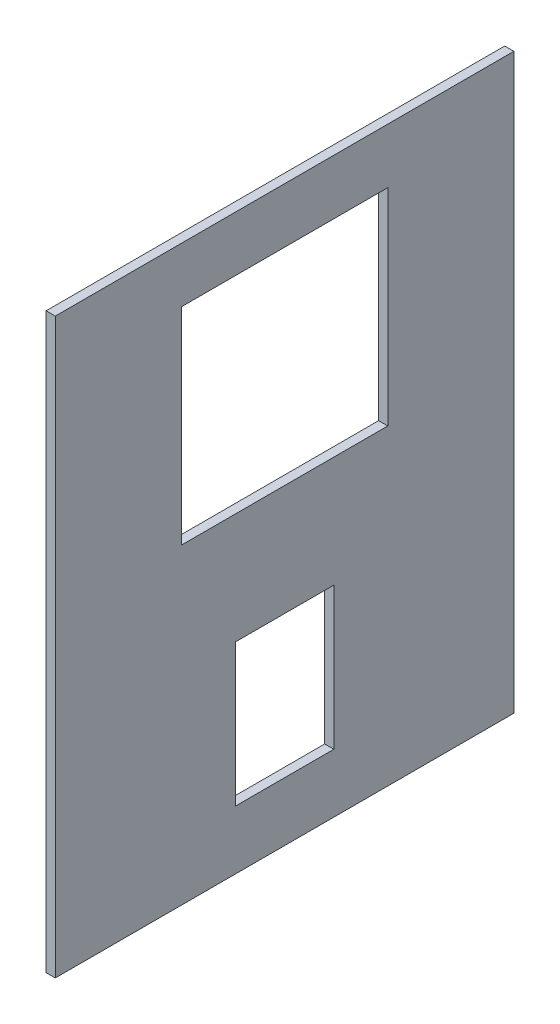
ISO-10303-21;
HEADER;
FILE_DESCRIPTION(('STEP AP214'),'2;1');
FILE_NAME('part.step','',(''),(''),'','','');
FILE_SCHEMA(('AUTOMOTIVE_DESIGN { 1 0 10303 214 1 1 1 1 }'));
ENDSEC;
DATA;
#1=APPLICATION_CONTEXT('core data for automotive mechanical design processes');
#2=APPLICATION_PROTOCOL_DEFINITION('international standard','automotive_design',2000,#1);
#3=PRODUCT_CONTEXT('',#1,'mechanical');
#4=PRODUCT('Part','Part','',(#3));
#5=PRODUCT_RELATED_PRODUCT_CATEGORY('part','',(#4));
#6=PRODUCT_DEFINITION_FORMATION('','',#4);
#7=PRODUCT_DEFINITION_CONTEXT('part definition',#1,'design');
#8=PRODUCT_DEFINITION('design','',#6,#7);
#9=PRODUCT_DEFINITION_SHAPE('','',#8);
#10=(LENGTH_UNIT() NAMED_UNIT(*) SI_UNIT(.MILLI.,.METRE.));
#11=(NAMED_UNIT(*) PLANE_ANGLE_UNIT() SI_UNIT($,.RADIAN.));
#12=(NAMED_UNIT(*) SI_UNIT($,.STERADIAN.) SOLID_ANGLE_UNIT());
#13=UNCERTAINTY_MEASURE_WITH_UNIT(LENGTH_MEASURE(1.E-05),#10,'distance_accuracy_value','');
#14=(GEOMETRIC_REPRESENTATION_CONTEXT(3) GLOBAL_UNCERTAINTY_ASSIGNED_CONTEXT((#13)) GLOBAL_UNIT_ASSIGNED_CONTEXT((#10,
#11,#12)) REPRESENTATION_CONTEXT('',''));
#15=CARTESIAN_POINT('',(0.,0.,0.));
#16=DIRECTION('',(0.,0.,1.));
#17=DIRECTION('',(1.,0.,0.));
#18=AXIS2_PLACEMENT_3D('',#15,#16,#17);
#19=CARTESIAN_POINT('',(60.5,62.5,50.));
#20=DIRECTION('',(-1.,0.,0.));
#21=DIRECTION('',(0.,0.,1.));
#22=AXIS2_PLACEMENT_3D('',#19,#20,#21);
#23=PLANE('',#22);
#24=DIRECTION('',(0.,1.,0.));
#25=VECTOR('',#24,1.);
#26=CARTESIAN_POINT('',(60.5,50.5,-22.5));
#27=LINE('',#26,#25);
#28=CARTESIAN_POINT('',(60.5,5.50000000000001,-22.5));
#29=VERTEX_POINT('',#28);
#30=CARTESIAN_POINT('',(60.5,50.5,-22.5));
#31=VERTEX_POINT('',#30);
#32=EDGE_CURVE('E133',#29,#31,#27,.T.);
#33=ORIENTED_EDGE('',*,*,#32,.T.);
#34=DIRECTION('',(0.,0.,1.));
#35=VECTOR('',#34,1.);
#36=CARTESIAN_POINT('',(60.5,50.5,22.5));
#37=LINE('',#36,#35);
#38=CARTESIAN_POINT('',(60.5,50.5,22.5));
#39=VERTEX_POINT('',#38);
#40=EDGE_CURVE('E126',#31,#39,#37,.T.);
#41=ORIENTED_EDGE('',*,*,#40,.T.);
#42=DIRECTION('',(0.,-1.,0.));
#43=VECTOR('',#42,1.);
#44=CARTESIAN_POINT('',(60.5,50.5,22.5));
#45=LINE('',#44,#43);
#46=CARTESIAN_POINT('',(60.5,5.50000000000001,22.5));
#47=VERTEX_POINT('',#46);
#48=EDGE_CURVE('E130',#39,#47,#45,.T.);
#49=ORIENTED_EDGE('',*,*,#48,.T.);
#50=DIRECTION('',(0.,0.,-1.));
#51=VECTOR('',#50,1.);
#52=CARTESIAN_POINT('',(60.5,5.50000000000001,22.5));
#53=LINE('',#52,#51);
#54=EDGE_CURVE('E151',#47,#29,#53,.T.);
#55=ORIENTED_EDGE('',*,*,#54,.T.);
#56=EDGE_LOOP('',(#33,#41,#49,#55));
#57=FACE_BOUND('',#56,.T.);
#58=DIRECTION('',(0.,1.,0.));
#59=VECTOR('',#58,1.);
#60=CARTESIAN_POINT('',(60.5,-18.6773814841814,-10.75));
#61=LINE('',#60,#59);
#62=CARTESIAN_POINT('',(60.5,-49.6773814841814,-10.75));
#63=VERTEX_POINT('',#62);
#64=CARTESIAN_POINT('',(60.5,-18.6773814841814,-10.75));
#65=VERTEX_POINT('',#64);
#66=EDGE_CURVE('E170',#63,#65,#61,.T.);
#67=ORIENTED_EDGE('',*,*,#66,.T.);
#68=DIRECTION('',(0.,0.,1.));
#69=VECTOR('',#68,1.);
#70=CARTESIAN_POINT('',(60.5,-18.6773814841814,10.75));
#71=LINE('',#70,#69);
#72=CARTESIAN_POINT('',(60.5,-18.6773814841814,10.75));
#73=VERTEX_POINT('',#72);
#74=EDGE_CURVE('E172',#65,#73,#71,.T.);
#75=ORIENTED_EDGE('',*,*,#74,.T.);
#76=DIRECTION('',(0.,-1.,0.));
#77=VECTOR('',#76,1.);
#78=CARTESIAN_POINT('',(60.5,-18.6773814841814,10.75));
#79=LINE('',#78,#77);
#80=CARTESIAN_POINT('',(60.5,-49.6773814841814,10.75));
#81=VERTEX_POINT('',#80);
#82=EDGE_CURVE('E175',#73,#81,#79,.T.);
#83=ORIENTED_EDGE('',*,*,#82,.T.);
#84=DIRECTION('',(0.,0.,-1.));
#85=VECTOR('',#84,1.);
#86=CARTESIAN_POINT('',(60.5,-49.6773814841814,10.75));
#87=LINE('',#86,#85);
#88=EDGE_CURVE('E177',#81,#63,#87,.T.);
#89=ORIENTED_EDGE('',*,*,#88,.T.);
#90=EDGE_LOOP('',(#67,#75,#83,#89));
#91=FACE_BOUND('',#90,.T.);
#92=DIRECTION('',(0.,0.,-1.));
#93=VECTOR('',#92,1.);
#94=CARTESIAN_POINT('',(60.5,62.5,0.));
#95=LINE('',#94,#93);
#96=CARTESIAN_POINT('',(60.5,62.5,50.));
#97=VERTEX_POINT('',#96);
#98=CARTESIAN_POINT('',(60.5,62.5,-50.));
#99=VERTEX_POINT('',#98);
#100=EDGE_CURVE('E11',#97,#99,#95,.T.);
#101=ORIENTED_EDGE('',*,*,#100,.T.);
#102=DIRECTION('',(0.,-1.,0.));
#103=VECTOR('',#102,1.);
#104=CARTESIAN_POINT('',(60.5,62.5,-50.));
#105=LINE('',#104,#103);
#106=CARTESIAN_POINT('',(60.5,-62.5,-50.));
#107=VERTEX_POINT('',#106);
#108=EDGE_CURVE('E38',#99,#107,#105,.T.);
#109=ORIENTED_EDGE('',*,*,#108,.T.);
#110=DIRECTION('',(0.,0.,-1.));
#111=VECTOR('',#110,1.);
#112=CARTESIAN_POINT('',(60.5,-62.5,0.));
#113=LINE('',#112,#111);
#114=CARTESIAN_POINT('',(60.5,-62.5,50.));
#115=VERTEX_POINT('',#114);
#116=EDGE_CURVE('E214',#115,#107,#113,.T.);
#117=ORIENTED_EDGE('',*,*,#116,.F.);
#118=DIRECTION('',(0.,1.,0.));
#119=VECTOR('',#118,1.);
#120=CARTESIAN_POINT('',(60.5,62.5,50.));
#121=LINE('',#120,#119);
#122=EDGE_CURVE('E43',#115,#97,#121,.T.);
#123=ORIENTED_EDGE('',*,*,#122,.T.);
#124=EDGE_LOOP('',(#101,#109,#117,#123));
#125=FACE_BOUND('',#124,.T.);
#126=ADVANCED_FACE('F34',(#57,#91,#125),#23,.T.);
#127=CARTESIAN_POINT('',(60.5,50.5,22.5));
#128=DIRECTION('',(0.,1.,0.));
#129=DIRECTION('',(0.,0.,1.));
#130=AXIS2_PLACEMENT_3D('',#127,#128,#129);
#131=PLANE('',#130);
#132=DIRECTION('',(0.,0.,1.));
#133=VECTOR('',#132,1.);
#134=CARTESIAN_POINT('',(62.5,50.5,22.5));
#135=LINE('',#134,#133);
#136=CARTESIAN_POINT('',(62.5,50.5,-22.5));
#137=VERTEX_POINT('',#136);
#138=CARTESIAN_POINT('',(62.5,50.5,22.5));
#139=VERTEX_POINT('',#138);
#140=EDGE_CURVE('E142',#137,#139,#135,.T.);
#141=ORIENTED_EDGE('',*,*,#140,.T.);
#142=DIRECTION('',(1.,0.,0.));
#143=VECTOR('',#142,1.);
#144=CARTESIAN_POINT('',(60.5,50.5,22.5));
#145=LINE('',#144,#143);
#146=EDGE_CURVE('E139',#39,#139,#145,.T.);
#147=ORIENTED_EDGE('',*,*,#146,.F.);
#148=ORIENTED_EDGE('',*,*,#40,.F.);
#149=DIRECTION('',(1.,0.,0.));
#150=VECTOR('',#149,1.);
#151=CARTESIAN_POINT('',(60.5,50.5,-22.5));
#152=LINE('',#151,#150);
#153=EDGE_CURVE('E147',#31,#137,#152,.T.);
#154=ORIENTED_EDGE('',*,*,#153,.T.);
#155=EDGE_LOOP('',(#141,#147,#148,#154));
#156=FACE_BOUND('',#155,.T.);
#157=ADVANCED_FACE('F140',(#156),#131,.F.);
#158=CARTESIAN_POINT('',(60.5,50.5,22.5));
#159=DIRECTION('',(0.,0.,1.));
#160=DIRECTION('',(0.,-1.,0.));
#161=AXIS2_PLACEMENT_3D('',#158,#159,#160);
#162=PLANE('',#161);
#163=DIRECTION('',(0.,-1.,0.));
#164=VECTOR('',#163,1.);
#165=CARTESIAN_POINT('',(62.5,50.5,22.5));
#166=LINE('',#165,#164);
#167=CARTESIAN_POINT('',(62.5,5.50000000000001,22.5));
#168=VERTEX_POINT('',#167);
#169=EDGE_CURVE('E160',#139,#168,#166,.T.);
#170=ORIENTED_EDGE('',*,*,#169,.T.);
#171=DIRECTION('',(1.,0.,0.));
#172=VECTOR('',#171,1.);
#173=CARTESIAN_POINT('',(60.5,5.50000000000001,22.5));
#174=LINE('',#173,#172);
#175=EDGE_CURVE('E146',#47,#168,#174,.T.);
#176=ORIENTED_EDGE('',*,*,#175,.F.);
#177=ORIENTED_EDGE('',*,*,#48,.F.);
#178=ORIENTED_EDGE('',*,*,#146,.T.);
#179=EDGE_LOOP('',(#170,#176,#177,#178));
#180=FACE_BOUND('',#179,.T.);
#181=ADVANCED_FACE('F149',(#180),#162,.F.);
#182=CARTESIAN_POINT('',(60.5,50.5,-22.5));
#183=DIRECTION('',(0.,0.,-1.));
#184=DIRECTION('',(0.,1.,0.));
#185=AXIS2_PLACEMENT_3D('',#182,#183,#184);
#186=PLANE('',#185);
#187=DIRECTION('',(0.,1.,0.));
#188=VECTOR('',#187,1.);
#189=CARTESIAN_POINT('',(62.5,50.5,-22.5));
#190=LINE('',#189,#188);
#191=CARTESIAN_POINT('',(62.5,5.50000000000001,-22.5));
#192=VERTEX_POINT('',#191);
#193=EDGE_CURVE('E156',#192,#137,#190,.T.);
#194=ORIENTED_EDGE('',*,*,#193,.T.);
#195=ORIENTED_EDGE('',*,*,#153,.F.);
#196=ORIENTED_EDGE('',*,*,#32,.F.);
#197=DIRECTION('',(1.,0.,0.));
#198=VECTOR('',#197,1.);
#199=CARTESIAN_POINT('',(60.5,5.50000000000001,-22.5));
#200=LINE('',#199,#198);
#201=EDGE_CURVE('E165',#29,#192,#200,.T.);
#202=ORIENTED_EDGE('',*,*,#201,.T.);
#203=EDGE_LOOP('',(#194,#195,#196,#202));
#204=FACE_BOUND('',#203,.T.);
#205=ADVANCED_FACE('F257',(#204),#186,.F.);
#206=CARTESIAN_POINT('',(60.5,-18.6773814841814,10.75));
#207=DIRECTION('',(0.,1.,0.));
#208=DIRECTION('',(0.,0.,1.));
#209=AXIS2_PLACEMENT_3D('',#206,#207,#208);
#210=PLANE('',#209);
#211=DIRECTION('',(0.,0.,1.));
#212=VECTOR('',#211,1.);
#213=CARTESIAN_POINT('',(62.5,-18.6773814841814,10.75));
#214=LINE('',#213,#212);
#215=CARTESIAN_POINT('',(62.5,-18.6773814841814,-10.75));
#216=VERTEX_POINT('',#215);
#217=CARTESIAN_POINT('',(62.5,-18.6773814841814,10.75));
#218=VERTEX_POINT('',#217);
#219=EDGE_CURVE('E182',#216,#218,#214,.T.);
#220=ORIENTED_EDGE('',*,*,#219,.T.);
#221=DIRECTION('',(1.,0.,0.));
#222=VECTOR('',#221,1.);
#223=CARTESIAN_POINT('',(60.5,-18.6773814841814,10.75));
#224=LINE('',#223,#222);
#225=EDGE_CURVE('E193',#73,#218,#224,.T.);
#226=ORIENTED_EDGE('',*,*,#225,.F.);
#227=ORIENTED_EDGE('',*,*,#74,.F.);
#228=DIRECTION('',(1.,0.,0.));
#229=VECTOR('',#228,1.);
#230=CARTESIAN_POINT('',(60.5,-18.6773814841814,-10.75));
#231=LINE('',#230,#229);
#232=EDGE_CURVE('E179',#65,#216,#231,.T.);
#233=ORIENTED_EDGE('',*,*,#232,.T.);
#234=EDGE_LOOP('',(#220,#226,#227,#233));
#235=FACE_BOUND('',#234,.T.);
#236=ADVANCED_FACE('F261',(#235),#210,.F.);
#237=CARTESIAN_POINT('',(60.5,-18.6773814841814,10.75));
#238=DIRECTION('',(0.,0.,1.));
#239=DIRECTION('',(1.,0.,0.));
#240=AXIS2_PLACEMENT_3D('',#237,#238,#239);
#241=PLANE('',#240);
#242=DIRECTION('',(0.,-1.,0.));
#243=VECTOR('',#242,1.);
#244=CARTESIAN_POINT('',(62.5,-18.6773814841814,10.75));
#245=LINE('',#244,#243);
#246=CARTESIAN_POINT('',(62.5,-49.6773814841814,10.75));
#247=VERTEX_POINT('',#246);
#248=EDGE_CURVE('E185',#218,#247,#245,.T.);
#249=ORIENTED_EDGE('',*,*,#248,.T.);
#250=DIRECTION('',(1.,0.,0.));
#251=VECTOR('',#250,1.);
#252=CARTESIAN_POINT('',(60.5,-49.6773814841814,10.75));
#253=LINE('',#252,#251);
#254=EDGE_CURVE('E191',#81,#247,#253,.T.);
#255=ORIENTED_EDGE('',*,*,#254,.F.);
#256=ORIENTED_EDGE('',*,*,#82,.F.);
#257=ORIENTED_EDGE('',*,*,#225,.T.);
#258=EDGE_LOOP('',(#249,#255,#256,#257));
#259=FACE_BOUND('',#258,.T.);
#260=ADVANCED_FACE('F264',(#259),#241,.F.);
#261=CARTESIAN_POINT('',(60.5,-18.6773814841814,-10.75));
#262=DIRECTION('',(0.,0.,-1.));
#263=DIRECTION('',(-1.,0.,0.));
#264=AXIS2_PLACEMENT_3D('',#261,#262,#263);
#265=PLANE('',#264);
#266=DIRECTION('',(0.,1.,0.));
#267=VECTOR('',#266,1.);
#268=CARTESIAN_POINT('',(62.5,-18.6773814841814,-10.75));
#269=LINE('',#268,#267);
#270=CARTESIAN_POINT('',(62.5,-49.6773814841814,-10.75));
#271=VERTEX_POINT('',#270);
#272=EDGE_CURVE('E180',#271,#216,#269,.T.);
#273=ORIENTED_EDGE('',*,*,#272,.T.);
#274=ORIENTED_EDGE('',*,*,#232,.F.);
#275=ORIENTED_EDGE('',*,*,#66,.F.);
#276=DIRECTION('',(1.,0.,0.));
#277=VECTOR('',#276,1.);
#278=CARTESIAN_POINT('',(60.5,-49.6773814841814,-10.75));
#279=LINE('',#278,#277);
#280=EDGE_CURVE('E158',#63,#271,#279,.T.);
#281=ORIENTED_EDGE('',*,*,#280,.T.);
#282=EDGE_LOOP('',(#273,#274,#275,#281));
#283=FACE_BOUND('',#282,.T.);
#284=ADVANCED_FACE('F236',(#283),#265,.F.);
#285=CARTESIAN_POINT('',(62.5,62.5,50.));
#286=DIRECTION('',(-1.,0.,0.));
#287=DIRECTION('',(0.,0.,1.));
#288=AXIS2_PLACEMENT_3D('',#285,#286,#287);
#289=PLANE('',#288);
#290=ORIENTED_EDGE('',*,*,#140,.F.);
#291=ORIENTED_EDGE('',*,*,#193,.F.);
#292=DIRECTION('',(0.,0.,-1.));
#293=VECTOR('',#292,1.);
#294=CARTESIAN_POINT('',(62.5,5.50000000000001,22.5));
#295=LINE('',#294,#293);
#296=EDGE_CURVE('E162',#168,#192,#295,.T.);
#297=ORIENTED_EDGE('',*,*,#296,.F.);
#298=ORIENTED_EDGE('',*,*,#169,.F.);
#299=EDGE_LOOP('',(#290,#291,#297,#298));
#300=FACE_BOUND('',#299,.T.);
#301=ORIENTED_EDGE('',*,*,#219,.F.);
#302=ORIENTED_EDGE('',*,*,#272,.F.);
#303=DIRECTION('',(0.,0.,-1.));
#304=VECTOR('',#303,1.);
#305=CARTESIAN_POINT('',(62.5,-49.6773814841814,10.75));
#306=LINE('',#305,#304);
#307=EDGE_CURVE('E173',#247,#271,#306,.T.);
#308=ORIENTED_EDGE('',*,*,#307,.F.);
#309=ORIENTED_EDGE('',*,*,#248,.F.);
#310=EDGE_LOOP('',(#301,#302,#308,#309));
#311=FACE_BOUND('',#310,.T.);
#312=DIRECTION('',(0.,0.,-1.));
#313=VECTOR('',#312,1.);
#314=CARTESIAN_POINT('',(62.5,-62.5,50.));
#315=LINE('',#314,#313);
#316=CARTESIAN_POINT('',(62.5,-62.5,50.));
#317=VERTEX_POINT('',#316);
#318=CARTESIAN_POINT('',(62.5,-62.5,-50.));
#319=VERTEX_POINT('',#318);
#320=EDGE_CURVE('E167',#317,#319,#315,.T.);
#321=ORIENTED_EDGE('',*,*,#320,.T.);
#322=DIRECTION('',(0.,-1.,0.));
#323=VECTOR('',#322,1.);
#324=CARTESIAN_POINT('',(62.5,62.5,-50.));
#325=LINE('',#324,#323);
#326=CARTESIAN_POINT('',(62.5,62.5,-50.));
#327=VERTEX_POINT('',#326);
#328=EDGE_CURVE('E211',#327,#319,#325,.T.);
#329=ORIENTED_EDGE('',*,*,#328,.F.);
#330=DIRECTION('',(0.,0.,-1.));
#331=VECTOR('',#330,1.);
#332=CARTESIAN_POINT('',(62.5,62.5,50.));
#333=LINE('',#332,#331);
#334=CARTESIAN_POINT('',(62.5,62.5,50.));
#335=VERTEX_POINT('',#334);
#336=EDGE_CURVE('E197',#335,#327,#333,.T.);
#337=ORIENTED_EDGE('',*,*,#336,.F.);
#338=DIRECTION('',(0.,-1.,0.));
#339=VECTOR('',#338,1.);
#340=CARTESIAN_POINT('',(62.5,62.5,50.));
#341=LINE('',#340,#339);
#342=EDGE_CURVE('E202',#335,#317,#341,.T.);
#343=ORIENTED_EDGE('',*,*,#342,.T.);
#344=EDGE_LOOP('',(#321,#329,#337,#343));
#345=FACE_BOUND('',#344,.T.);
#346=ADVANCED_FACE('F36',(#300,#311,#345),#289,.F.);
#347=CARTESIAN_POINT('',(60.5,-49.6773814841814,10.75));
#348=DIRECTION('',(0.,-1.,0.));
#349=DIRECTION('',(0.,0.,-1.));
#350=AXIS2_PLACEMENT_3D('',#347,#348,#349);
#351=PLANE('',#350);
#352=ORIENTED_EDGE('',*,*,#307,.T.);
#353=ORIENTED_EDGE('',*,*,#280,.F.);
#354=ORIENTED_EDGE('',*,*,#88,.F.);
#355=ORIENTED_EDGE('',*,*,#254,.T.);
#356=EDGE_LOOP('',(#352,#353,#354,#355));
#357=FACE_BOUND('',#356,.T.);
#358=ADVANCED_FACE('F245',(#357),#351,.F.);
#359=CARTESIAN_POINT('',(60.5,5.50000000000001,22.5));
#360=DIRECTION('',(0.,-1.,0.));
#361=DIRECTION('',(0.,0.,-1.));
#362=AXIS2_PLACEMENT_3D('',#359,#360,#361);
#363=PLANE('',#362);
#364=ORIENTED_EDGE('',*,*,#296,.T.);
#365=ORIENTED_EDGE('',*,*,#201,.F.);
#366=ORIENTED_EDGE('',*,*,#54,.F.);
#367=ORIENTED_EDGE('',*,*,#175,.T.);
#368=EDGE_LOOP('',(#364,#365,#366,#367));
#369=FACE_BOUND('',#368,.T.);
#370=ADVANCED_FACE('F241',(#369),#363,.F.);
#371=CARTESIAN_POINT('',(-62.5,62.5,-50.));
#372=DIRECTION('',(0.,0.,1.));
#373=DIRECTION('',(1.,0.,0.));
#374=AXIS2_PLACEMENT_3D('',#371,#372,#373);
#375=PLANE('',#374);
#376=ORIENTED_EDGE('',*,*,#108,.F.);
#377=DIRECTION('',(-1.,0.,0.));
#378=VECTOR('',#377,1.);
#379=CARTESIAN_POINT('',(-62.5,62.5,-50.));
#380=LINE('',#379,#378);
#381=EDGE_CURVE('E51',#327,#99,#380,.T.);
#382=ORIENTED_EDGE('',*,*,#381,.F.);
#383=ORIENTED_EDGE('',*,*,#328,.T.);
#384=DIRECTION('',(-1.,0.,0.));
#385=VECTOR('',#384,1.);
#386=CARTESIAN_POINT('',(-62.5,-62.5,-50.));
#387=LINE('',#386,#385);
#388=EDGE_CURVE('E205',#319,#107,#387,.T.);
#389=ORIENTED_EDGE('',*,*,#388,.T.);
#390=EDGE_LOOP('',(#376,#382,#383,#389));
#391=FACE_BOUND('',#390,.T.);
#392=ADVANCED_FACE('F219',(#391),#375,.F.);
#393=CARTESIAN_POINT('',(-62.5,62.5,50.));
#394=DIRECTION('',(0.,0.,-1.));
#395=DIRECTION('',(-1.,0.,0.));
#396=AXIS2_PLACEMENT_3D('',#393,#394,#395);
#397=PLANE('',#396);
#398=ORIENTED_EDGE('',*,*,#122,.F.);
#399=DIRECTION('',(1.,0.,0.));
#400=VECTOR('',#399,1.);
#401=CARTESIAN_POINT('',(-62.5,-62.5,50.));
#402=LINE('',#401,#400);
#403=EDGE_CURVE('E199',#115,#317,#402,.T.);
#404=ORIENTED_EDGE('',*,*,#403,.T.);
#405=ORIENTED_EDGE('',*,*,#342,.F.);
#406=DIRECTION('',(1.,0.,0.));
#407=VECTOR('',#406,1.);
#408=CARTESIAN_POINT('',(-62.5,62.5,50.));
#409=LINE('',#408,#407);
#410=EDGE_CURVE('E59',#97,#335,#409,.T.);
#411=ORIENTED_EDGE('',*,*,#410,.F.);
#412=EDGE_LOOP('',(#398,#404,#405,#411));
#413=FACE_BOUND('',#412,.T.);
#414=ADVANCED_FACE('F225',(#413),#397,.F.);
#415=CARTESIAN_POINT('',(0.,-62.5,0.));
#416=DIRECTION('',(0.,-1.,0.));
#417=DIRECTION('',(0.,0.,-1.));
#418=AXIS2_PLACEMENT_3D('',#415,#416,#417);
#419=PLANE('',#418);
#420=ORIENTED_EDGE('',*,*,#403,.F.);
#421=ORIENTED_EDGE('',*,*,#116,.T.);
#422=ORIENTED_EDGE('',*,*,#388,.F.);
#423=ORIENTED_EDGE('',*,*,#320,.F.);
#424=EDGE_LOOP('',(#420,#421,#422,#423));
#425=FACE_BOUND('',#424,.T.);
#426=ADVANCED_FACE('F224',(#425),#419,.T.);
#427=CARTESIAN_POINT('',(0.,62.5,0.));
#428=DIRECTION('',(0.,-1.,0.));
#429=DIRECTION('',(0.,0.,-1.));
#430=AXIS2_PLACEMENT_3D('',#427,#428,#429);
#431=PLANE('',#430);
#432=ORIENTED_EDGE('',*,*,#100,.F.);
#433=ORIENTED_EDGE('',*,*,#410,.T.);
#434=ORIENTED_EDGE('',*,*,#336,.T.);
#435=ORIENTED_EDGE('',*,*,#381,.T.);
#436=EDGE_LOOP('',(#432,#433,#434,#435));
#437=FACE_BOUND('',#436,.T.);
#438=ADVANCED_FACE('F228',(#437),#431,.F.);
#439=CLOSED_SHELL('',(#126,#157,#181,#205,#236,#260,#284,#346,#358,#370,#392,#414,#426,#438));
#440=MANIFOLD_SOLID_BREP('B2',#439);
#441=ADVANCED_BREP_SHAPE_REPRESENTATION('',(#18,#440),#14);
#442=SHAPE_DEFINITION_REPRESENTATION(#9,#441);
ENDSEC;
END-ISO-10303-21;
